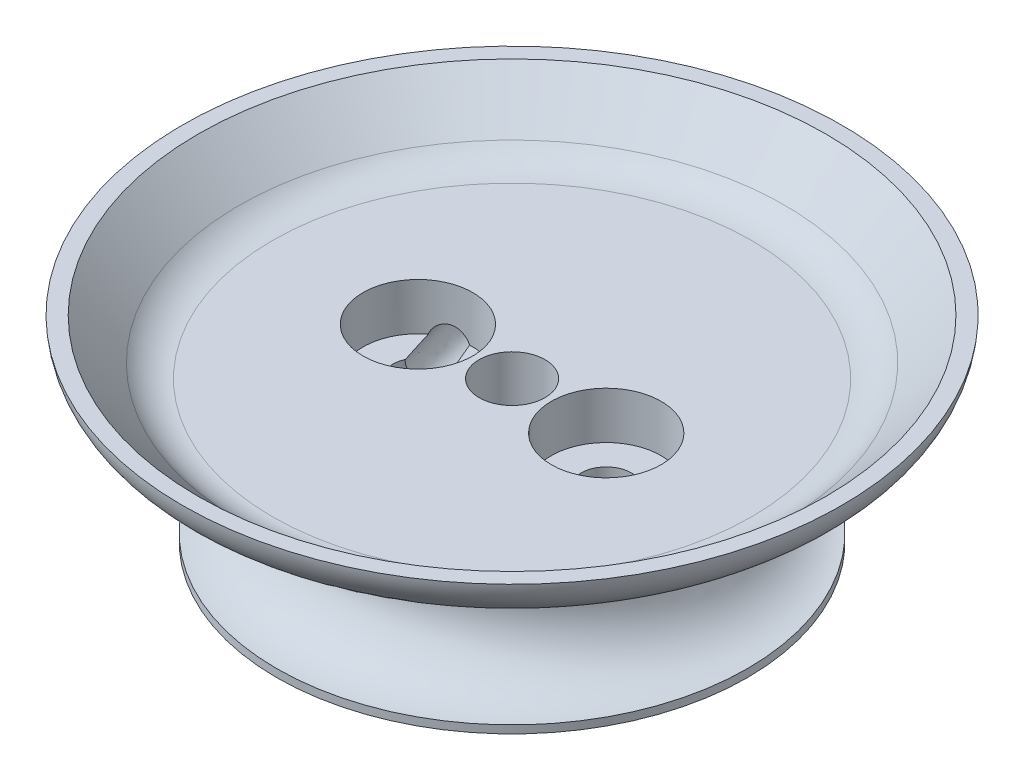
ISO-10303-21;
HEADER;
FILE_DESCRIPTION(('STEP AP214'),'2;1');
FILE_NAME('part.step','',(''),(''),'','','');
FILE_SCHEMA(('AUTOMOTIVE_DESIGN { 1 0 10303 214 1 1 1 1 }'));
ENDSEC;
DATA;
#1=APPLICATION_CONTEXT('core data for automotive mechanical design processes');
#2=APPLICATION_PROTOCOL_DEFINITION('international standard','automotive_design',2000,#1);
#3=PRODUCT_CONTEXT('',#1,'mechanical');
#4=PRODUCT('Part','Part','',(#3));
#5=PRODUCT_RELATED_PRODUCT_CATEGORY('part','',(#4));
#6=PRODUCT_DEFINITION_FORMATION('','',#4);
#7=PRODUCT_DEFINITION_CONTEXT('part definition',#1,'design');
#8=PRODUCT_DEFINITION('design','',#6,#7);
#9=PRODUCT_DEFINITION_SHAPE('','',#8);
#10=(LENGTH_UNIT() NAMED_UNIT(*) SI_UNIT(.MILLI.,.METRE.));
#11=(NAMED_UNIT(*) PLANE_ANGLE_UNIT() SI_UNIT($,.RADIAN.));
#12=(NAMED_UNIT(*) SI_UNIT($,.STERADIAN.) SOLID_ANGLE_UNIT());
#13=UNCERTAINTY_MEASURE_WITH_UNIT(LENGTH_MEASURE(1.E-05),#10,'distance_accuracy_value','');
#14=(GEOMETRIC_REPRESENTATION_CONTEXT(3) GLOBAL_UNCERTAINTY_ASSIGNED_CONTEXT((#13)) GLOBAL_UNIT_ASSIGNED_CONTEXT((#10,
#11,#12)) REPRESENTATION_CONTEXT('',''));
#15=CARTESIAN_POINT('',(0.,0.,0.));
#16=DIRECTION('',(0.,0.,1.));
#17=DIRECTION('',(1.,0.,0.));
#18=AXIS2_PLACEMENT_3D('',#15,#16,#17);
#19=CARTESIAN_POINT('',(0.,4.5,0.));
#20=DIRECTION('',(0.,1.,0.));
#21=DIRECTION('',(0.,0.,1.));
#22=AXIS2_PLACEMENT_3D('',#19,#20,#21);
#23=TOROIDAL_SURFACE('',#22,15.,4.);
#24=CARTESIAN_POINT('',(-7.6107388093674,4.70180364396145,-7.949134860586));
#25=CARTESIAN_POINT('',(-7.61455789786454,4.6686572515954,-7.94315436289037));
#26=CARTESIAN_POINT('',(-7.61958606683922,4.63575123129847,-7.93660843598661));
#27=CARTESIAN_POINT('',(-7.63201156035223,4.5706366477425,-7.92233022037204));
#28=CARTESIAN_POINT('',(-7.6394099111094,4.53842839305623,-7.91459741853621));
#29=CARTESIAN_POINT('',(-7.65656896513071,4.47478605534365,-7.89785053655688));
#30=CARTESIAN_POINT('',(-7.66634204843772,4.44335701310675,-7.88882984746681));
#31=CARTESIAN_POINT('',(-7.6881955341962,4.38176560585421,-7.86941529914597));
#32=CARTESIAN_POINT('',(-7.70027554884008,4.35160302897705,-7.85902167080408));
#33=CARTESIAN_POINT('',(-7.73980693648511,4.26319281944033,-7.82568972230608));
#34=CARTESIAN_POINT('',(-7.77051844963673,4.20713699742779,-7.80062959164697));
#35=CARTESIAN_POINT('',(-7.83922786924663,4.10335920260703,-7.74435467375169));
#36=CARTESIAN_POINT('',(-7.87720306576677,4.05561211841925,-7.71315906075959));
#37=CARTESIAN_POINT('',(-7.93653611921127,3.99373612628725,-7.6628727557003));
#38=CARTESIAN_POINT('',(-7.95577326261854,3.97539155632235,-7.64636019300824));
#39=CARTESIAN_POINT('',(-7.99514440189959,3.94108020268109,-7.61198820152185));
#40=CARTESIAN_POINT('',(-8.0152784580179,3.9251135790423,-7.59412868219808));
#41=CARTESIAN_POINT('',(-8.07662340086016,3.88081674196887,-7.53867873747517));
#42=CARTESIAN_POINT('',(-8.11878929005731,3.8560770914485,-7.49920673870995));
#43=CARTESIAN_POINT('',(-8.2013129719908,3.81757881653221,-7.41850104060084));
#44=CARTESIAN_POINT('',(-8.2416408901938,3.80328596987817,-7.37748743085846));
#45=CARTESIAN_POINT('',(-8.30151525461729,3.78834228058623,-7.31393613310904));
#46=CARTESIAN_POINT('',(-8.32137524098697,3.78444348909593,-7.29240837056939));
#47=CARTESIAN_POINT('',(-8.36077333104861,3.7787786311732,-7.24878414023921));
#48=CARTESIAN_POINT('',(-8.38031138740677,3.77701287565211,-7.22668759002149));
#49=CARTESIAN_POINT('',(-8.4526128554277,3.77417827588447,-7.14318320215401));
#50=CARTESIAN_POINT('',(-8.50402925791464,3.77966918187586,-7.08027941040504));
#51=CARTESIAN_POINT('',(-8.57790969101007,3.79706809778802,-6.98529717121271));
#52=CARTESIAN_POINT('',(-8.60202683081585,3.80441131654224,-6.95348767752394));
#53=CARTESIAN_POINT('',(-8.64920225952622,3.82193836494181,-6.88981575683615));
#54=CARTESIAN_POINT('',(-8.67225993151241,3.83212382578526,-6.85795330991591));
#55=CARTESIAN_POINT('',(-8.72315042488952,3.85813582616913,-6.7861249967763));
#56=CARTESIAN_POINT('',(-8.75066061742847,3.87474076381045,-6.74621256247205));
#57=CARTESIAN_POINT('',(-8.80393332949222,3.91198944408395,-6.66707963548724));
#58=CARTESIAN_POINT('',(-8.82969479444557,3.93263559513763,-6.62785957070492));
#59=CARTESIAN_POINT('',(-8.87955776678746,3.97767647531636,-6.55047969391554));
#60=CARTESIAN_POINT('',(-8.90365779861299,4.00207447599153,-6.51232084189316));
#61=CARTESIAN_POINT('',(-8.95026440716493,4.05436925622113,-6.43748513420039));
#62=CARTESIAN_POINT('',(-8.97277161976179,4.08226462712035,-6.40080768967523));
#63=CARTESIAN_POINT('',(-9.01662807472532,4.14194457311133,-6.32876106876815));
#64=CARTESIAN_POINT('',(-9.03795235129531,4.17378530524648,-6.29342310885723));
#65=CARTESIAN_POINT('',(-9.07903963742292,4.24095283652872,-6.22529431902566));
#66=CARTESIAN_POINT('',(-9.09880406882036,4.27627639333892,-6.19250116991014));
#67=CARTESIAN_POINT('',(-9.13660285097579,4.35029153349616,-6.13039261140444));
#68=CARTESIAN_POINT('',(-9.1546471639613,4.38896088884478,-6.10105690996019));
#69=CARTESIAN_POINT('',(-9.18907308858757,4.46976744562325,-6.0464867412353));
#70=CARTESIAN_POINT('',(-9.20545625519127,4.5119013357881,-6.02124842492263));
#71=CARTESIAN_POINT('',(-9.22916068316583,4.5791101905544,-5.98652786070363));
#72=CARTESIAN_POINT('',(-9.23714978571498,4.60299463798329,-5.97518056424446));
#73=CARTESIAN_POINT('',(-9.25257066391501,4.6517103231883,-5.95414064698203));
#74=CARTESIAN_POINT('',(-9.26000138636458,4.67654322317901,-5.94445111114208));
#75=CARTESIAN_POINT('',(-9.26712645593163,4.70180364396145,-5.93569351516457));
#76=B_SPLINE_CURVE_WITH_KNOTS('',3,(#24,#25,#26,#27,#28,#29,#30,#31,#32,#33,#34,#35,#36,#37,#38,
#39,#40,#41,#42,#43,#44,#45,#46,#47,#48,#49,#50,#51,#52,#53,#54,#55,#56,#57,#58,#59,#60,#61,#62,
#63,#64,#65,#66,#67,#68,#69,#70,#71,#72,#73,#74,#75),.UNSPECIFIED.,.F.,.F.,(4,2,2,2,2,2,2,2,2,2,
2,2,2,2,2,2,2,2,2,2,2,2,2,2,2,4),(0.,0.10166571558766,0.2033755090584,0.305627365976308,
0.407862048913067,0.612692637624994,0.816892991893086,0.910653707829283,1.00442073108311,
1.19189499266689,1.36894212304485,1.45750903984707,1.54608886460597,1.78881212592681,
1.91051003514753,2.03227793246941,2.18579756437597,2.3394089687103,2.49315508721402,
2.64683947829098,2.80303793160987,2.95909232078733,3.11417964853485,3.26912043549941,
3.35192619577278,3.43488441347043),.UNSPECIFIED.);
#77=CARTESIAN_POINT('',(-7.61073880936739,4.70180364396146,-7.94913486058595));
#78=VERTEX_POINT('',#77);
#79=CARTESIAN_POINT('',(-9.26712645593164,4.70180364396146,-5.93569351516459));
#80=VERTEX_POINT('',#79);
#81=EDGE_CURVE('E92',#78,#80,#76,.T.);
#82=ORIENTED_EDGE('',*,*,#81,.F.);
#83=CARTESIAN_POINT('',(0.,4.70180364396145,0.));
#84=DIRECTION('',(0.,-1.,0.));
#85=DIRECTION('',(0.,0.,-1.));
#86=AXIS2_PLACEMENT_3D('',#83,#84,#85);
#87=CIRCLE('',#86,11.0050938322304);
#88=EDGE_CURVE('E97',#78,#80,#87,.T.);
#89=ORIENTED_EDGE('',*,*,#88,.T.);
#90=EDGE_LOOP('',(#82,#89));
#91=FACE_BOUND('',#90,.T.);
#92=CARTESIAN_POINT('',(0.,0.5,0.));
#93=DIRECTION('',(0.,1.,0.));
#94=DIRECTION('',(0.,0.,1.));
#95=AXIS2_PLACEMENT_3D('',#92,#93,#94);
#96=CIRCLE('',#95,15.);
#97=CARTESIAN_POINT('',(0.,0.5,15.));
#98=VERTEX_POINT('',#97);
#99=EDGE_CURVE('E345',#98,#98,#96,.T.);
#100=ORIENTED_EDGE('',*,*,#99,.T.);
#101=EDGE_LOOP('',(#100));
#102=FACE_BOUND('',#101,.T.);
#103=ADVANCED_FACE('F46',(#91,#102),#23,.F.);
#104=CARTESIAN_POINT('',(0.,9.,0.));
#105=DIRECTION('',(0.,-1.,0.));
#106=DIRECTION('',(0.,0.,-1.));
#107=AXIS2_PLACEMENT_3D('',#104,#105,#106);
#108=CYLINDRICAL_SURFACE('',#107,15.);
#109=CARTESIAN_POINT('',(0.,0.,0.));
#110=DIRECTION('',(0.,1.,0.));
#111=DIRECTION('',(0.,0.,1.));
#112=AXIS2_PLACEMENT_3D('',#109,#110,#111);
#113=CIRCLE('',#112,15.);
#114=CARTESIAN_POINT('',(0.,0.,15.));
#115=VERTEX_POINT('',#114);
#116=EDGE_CURVE('E376',#115,#115,#113,.T.);
#117=ORIENTED_EDGE('',*,*,#116,.T.);
#118=EDGE_LOOP('',(#117));
#119=FACE_BOUND('',#118,.T.);
#120=ORIENTED_EDGE('',*,*,#99,.F.);
#121=EDGE_LOOP('',(#120));
#122=FACE_BOUND('',#121,.T.);
#123=ADVANCED_FACE('F196',(#119,#122),#108,.T.);
#124=CARTESIAN_POINT('',(6.,-0.000999999999999265,0.));
#125=DIRECTION('',(0.,1.,0.));
#126=DIRECTION('',(0.,0.,1.));
#127=AXIS2_PLACEMENT_3D('',#124,#125,#126);
#128=CYLINDRICAL_SURFACE('',#127,1.6);
#129=CARTESIAN_POINT('',(6.,0.,0.));
#130=DIRECTION('',(0.,1.,0.));
#131=DIRECTION('',(0.,0.,1.));
#132=AXIS2_PLACEMENT_3D('',#129,#130,#131);
#133=CIRCLE('',#132,1.6);
#134=CARTESIAN_POINT('',(6.,0.,1.6));
#135=VERTEX_POINT('',#134);
#136=EDGE_CURVE('E367',#135,#135,#133,.F.);
#137=ORIENTED_EDGE('',*,*,#136,.T.);
#138=EDGE_LOOP('',(#137));
#139=FACE_BOUND('',#138,.T.);
#140=CARTESIAN_POINT('',(6.,6.,0.));
#141=DIRECTION('',(0.,1.,0.));
#142=DIRECTION('',(0.,0.,1.));
#143=AXIS2_PLACEMENT_3D('',#140,#141,#142);
#144=CIRCLE('',#143,1.6);
#145=CARTESIAN_POINT('',(6.,6.,1.6));
#146=VERTEX_POINT('',#145);
#147=EDGE_CURVE('E370',#146,#146,#144,.F.);
#148=ORIENTED_EDGE('',*,*,#147,.F.);
#149=EDGE_LOOP('',(#148));
#150=FACE_BOUND('',#149,.T.);
#151=ADVANCED_FACE('F192',(#139,#150),#128,.F.);
#152=CARTESIAN_POINT('',(-6.,-0.000999999999999265,0.));
#153=DIRECTION('',(0.,1.,0.));
#154=DIRECTION('',(0.,0.,1.));
#155=AXIS2_PLACEMENT_3D('',#152,#153,#154);
#156=CYLINDRICAL_SURFACE('',#155,1.6);
#157=CARTESIAN_POINT('',(-6.,0.,0.));
#158=DIRECTION('',(0.,1.,0.));
#159=DIRECTION('',(0.,0.,1.));
#160=AXIS2_PLACEMENT_3D('',#157,#158,#159);
#161=CIRCLE('',#160,1.6);
#162=CARTESIAN_POINT('',(-6.,0.,1.6));
#163=VERTEX_POINT('',#162);
#164=EDGE_CURVE('E363',#163,#163,#161,.F.);
#165=ORIENTED_EDGE('',*,*,#164,.T.);
#166=EDGE_LOOP('',(#165));
#167=FACE_BOUND('',#166,.T.);
#168=CARTESIAN_POINT('',(-6.,6.,0.));
#169=DIRECTION('',(0.,1.,0.));
#170=DIRECTION('',(0.,0.,1.));
#171=AXIS2_PLACEMENT_3D('',#168,#169,#170);
#172=CIRCLE('',#171,1.6);
#173=CARTESIAN_POINT('',(-5.34895896784697,6.,-1.46155587455735));
#174=VERTEX_POINT('',#173);
#175=CARTESIAN_POINT('',(-7.45937001936482,6.,-0.655926174640964));
#176=VERTEX_POINT('',#175);
#177=EDGE_CURVE('E354',#174,#176,#172,.F.);
#178=ORIENTED_EDGE('',*,*,#177,.F.);
#179=CARTESIAN_POINT('',(-5.34895896784697,6.,-1.46155587455735));
#180=CARTESIAN_POINT('',(-5.34354743783377,5.97388547998231,-1.45913946316189));
#181=CARTESIAN_POINT('',(-5.33920814498966,5.94750510563134,-1.45717613996484));
#182=CARTESIAN_POINT('',(-5.33270620521504,5.89443880669064,-1.45421330527356));
#183=CARTESIAN_POINT('',(-5.33054238254293,5.86775305503943,-1.45321327317704));
#184=CARTESIAN_POINT('',(-5.32842794779344,5.81453297946142,-1.45223668227594));
#185=CARTESIAN_POINT('',(-5.3284560594642,5.78799969952312,-1.45225028446139));
#186=CARTESIAN_POINT('',(-5.33063461449203,5.73504594971222,-1.45325521014921));
#187=CARTESIAN_POINT('',(-5.33278523097452,5.70862548921848,-1.45424661340746));
#188=CARTESIAN_POINT('',(-5.34225970708156,5.62988052923174,-1.45857207190879));
#189=CARTESIAN_POINT('',(-5.35260253187795,5.57796094987053,-1.46325586312633));
#190=CARTESIAN_POINT('',(-5.38060283869132,5.47641287868827,-1.47532054640152));
#191=CARTESIAN_POINT('',(-5.39828112719855,5.42679135377635,-1.48270910324571));
#192=CARTESIAN_POINT('',(-5.44841079408508,5.310067410268,-1.50224813083063));
#193=CARTESIAN_POINT('',(-5.48394836874233,5.24439054558051,-1.51509440939141));
#194=CARTESIAN_POINT('',(-5.54510689948069,5.15104246461297,-1.53412175515823));
#195=CARTESIAN_POINT('',(-5.56683873080809,5.12074778009602,-1.5404327659997));
#196=CARTESIAN_POINT('',(-5.6126908309768,5.06192445402605,-1.55259621219412));
#197=CARTESIAN_POINT('',(-5.63681099914086,5.03339573811323,-1.5584486668583));
#198=CARTESIAN_POINT('',(-5.71336040051668,4.94985448767858,-1.57498884373283));
#199=CARTESIAN_POINT('',(-5.76937892723524,4.8977994593568,-1.58445479407132));
#200=CARTESIAN_POINT('',(-5.8897152894564,4.80359209425611,-1.59733453630503));
#201=CARTESIAN_POINT('',(-5.95400745334089,4.76141021867889,-1.60076658655961));
#202=CARTESIAN_POINT('',(-6.06777615882716,4.70108533968558,-1.59923088774722));
#203=CARTESIAN_POINT('',(-6.1154925955535,4.67956041238923,-1.59658003224347));
#204=CARTESIAN_POINT('',(-6.21295921122062,4.64330950431066,-1.58651899562207));
#205=CARTESIAN_POINT('',(-6.26270707575785,4.6285760090299,-1.57911409652021));
#206=CARTESIAN_POINT('',(-6.36325283480994,4.60688995988733,-1.55906598560806));
#207=CARTESIAN_POINT('',(-6.41405550234699,4.59998960220922,-1.54638839447616));
#208=CARTESIAN_POINT('',(-6.51455898662215,4.5948892250152,-1.51591059981735));
#209=CARTESIAN_POINT('',(-6.56425966734489,4.59669027355202,-1.49810976769123));
#210=CARTESIAN_POINT('',(-6.65600493741798,4.6077016353767,-1.46009570316903));
#211=CARTESIAN_POINT('',(-6.69831938406,4.61615733235881,-1.44029840281659));
#212=CARTESIAN_POINT('',(-6.77978631475333,4.63898566649539,-1.39787064485384));
#213=CARTESIAN_POINT('',(-6.81893919319233,4.65335756426926,-1.37524054152058));
#214=CARTESIAN_POINT('',(-6.89698004884233,4.68903042922083,-1.32580334048839));
#215=CARTESIAN_POINT('',(-6.93550698175521,4.71085023960296,-1.29880350254185));
#216=CARTESIAN_POINT('',(-7.00785924848329,4.7599322941682,-1.24350405389966));
#217=CARTESIAN_POINT('',(-7.04167993824347,4.78719985040042,-1.21520319549135));
#218=CARTESIAN_POINT('',(-7.12312786790557,4.86299907029928,-1.14153439768283));
#219=CARTESIAN_POINT('',(-7.16742719990196,4.91470802399358,-1.09576220752942));
#220=CARTESIAN_POINT('',(-7.24599690117387,5.0264628006792,-1.00551932213198));
#221=CARTESIAN_POINT('',(-7.28023750763752,5.08653260494304,-0.961052832858524));
#222=CARTESIAN_POINT('',(-7.32476726839249,5.18270183933272,-0.897596669083694));
#223=CARTESIAN_POINT('',(-7.33855522879746,5.21606518044797,-0.876830300829076));
#224=CARTESIAN_POINT('',(-7.36388376067582,5.28457969857245,-0.836885984439337));
#225=CARTESIAN_POINT('',(-7.37542346541774,5.31973155851852,-0.817708650528291));
#226=CARTESIAN_POINT('',(-7.39631411551475,5.39165443481449,-0.781500773448133));
#227=CARTESIAN_POINT('',(-7.40566960054749,5.428421900726,-0.764465812215923));
#228=CARTESIAN_POINT('',(-7.42226984426036,5.50354893295271,-0.733118408118711));
#229=CARTESIAN_POINT('',(-7.42951619044762,5.5419072768697,-0.718803920438187));
#230=CARTESIAN_POINT('',(-7.43967508960075,5.60621701858137,-0.698152669490929));
#231=CARTESIAN_POINT('',(-7.44321302714255,5.63174076184247,-0.690787504215386));
#232=CARTESIAN_POINT('',(-7.44935870179006,5.6833443084123,-0.677798917239184));
#233=CARTESIAN_POINT('',(-7.45196642725569,5.70942411867497,-0.672175517333992));
#234=CARTESIAN_POINT('',(-7.4562437161758,5.76191093698792,-0.662857726590875));
#235=CARTESIAN_POINT('',(-7.45791649148475,5.78831650235379,-0.659156734798353));
#236=CARTESIAN_POINT('',(-7.46029412883945,5.84138048288216,-0.653872882923651));
#237=CARTESIAN_POINT('',(-7.46099933798618,5.86803880391461,-0.652289263268678));
#238=CARTESIAN_POINT('',(-7.46133861238145,5.91228121009195,-0.651528591757561));
#239=CARTESIAN_POINT('',(-7.46125627471148,5.92985450344877,-0.651714282225484));
#240=CARTESIAN_POINT('',(-7.46064833765346,5.96497005838659,-0.653074372988947));
#241=CARTESIAN_POINT('',(-7.46012235717764,5.98251228029085,-0.654249623311795));
#242=CARTESIAN_POINT('',(-7.45937001936482,6.,-0.655926174640966));
#243=B_SPLINE_CURVE_WITH_KNOTS('',3,(#179,#180,#181,#182,#183,#184,#185,#186,#187,#188,#189,
#190,#191,#192,#193,#194,#195,#196,#197,#198,#199,#200,#201,#202,#203,#204,#205,#206,#207,#208,
#209,#210,#211,#212,#213,#214,#215,#216,#217,#218,#219,#220,#221,#222,#223,#224,#225,#226,#227,
#228,#229,#230,#231,#232,#233,#234,#235,#236,#237,#238,#239,#240,#241,#242),.UNSPECIFIED.,.F.,
.F.,(4,2,2,2,2,2,2,2,2,2,2,2,2,2,2,2,2,2,2,2,2,2,2,2,2,2,2,2,2,2,2,4),(0.,0.0803118497854571,
0.160580271338293,0.240069656544772,0.319565525963129,0.4782268560908,0.637341327195638,
0.863377729357667,0.976722655297722,1.09006280536199,1.32003693785584,1.54931397155168,
1.70594552976636,1.86240336177528,2.01989774230956,2.17741145495793,2.31926140202512,
2.46109362669281,2.61607437561524,2.77120698901708,3.01606230738722,3.26163499581189,
3.38646440616901,3.51134184505678,3.6359573812969,3.76047887788334,3.84081196008785,
3.92114604749452,4.00120243803904,4.08123010194418,4.13392227443352,4.1866597554843),.UNSPECIFIED.);
#244=EDGE_CURVE('E127',#174,#176,#243,.T.);
#245=ORIENTED_EDGE('',*,*,#244,.T.);
#246=EDGE_LOOP('',(#178,#245));
#247=FACE_BOUND('',#246,.T.);
#248=ADVANCED_FACE('F187',(#167,#247),#156,.F.);
#249=CARTESIAN_POINT('',(0.,9.,0.));
#250=DIRECTION('',(0.,1.,0.));
#251=DIRECTION('',(0.,0.,1.));
#252=AXIS2_PLACEMENT_3D('',#249,#250,#251);
#253=PLANE('',#252);
#254=CARTESIAN_POINT('',(0.,9.,0.));
#255=DIRECTION('',(0.,1.,0.));
#256=DIRECTION('',(0.,0.,1.));
#257=AXIS2_PLACEMENT_3D('',#254,#255,#256);
#258=CIRCLE('',#257,15.2573593128808);
#259=CARTESIAN_POINT('',(0.,9.,15.2573593128808));
#260=VERTEX_POINT('',#259);
#261=EDGE_CURVE('E387',#260,#260,#258,.T.);
#262=ORIENTED_EDGE('',*,*,#261,.T.);
#263=EDGE_LOOP('',(#262));
#264=FACE_BOUND('',#263,.T.);
#265=CARTESIAN_POINT('',(-6.,9.,0.));
#266=DIRECTION('',(0.,1.,0.));
#267=DIRECTION('',(0.,0.,1.));
#268=AXIS2_PLACEMENT_3D('',#265,#266,#267);
#269=CIRCLE('',#268,3.5);
#270=CARTESIAN_POINT('',(-6.,9.,3.5));
#271=VERTEX_POINT('',#270);
#272=EDGE_CURVE('E355',#271,#271,#269,.T.);
#273=ORIENTED_EDGE('',*,*,#272,.F.);
#274=EDGE_LOOP('',(#273));
#275=FACE_BOUND('',#274,.T.);
#276=CARTESIAN_POINT('',(6.,9.,0.));
#277=DIRECTION('',(0.,1.,0.));
#278=DIRECTION('',(0.,0.,1.));
#279=AXIS2_PLACEMENT_3D('',#276,#277,#278);
#280=CIRCLE('',#279,3.5);
#281=CARTESIAN_POINT('',(6.,9.,3.5));
#282=VERTEX_POINT('',#281);
#283=EDGE_CURVE('E347',#282,#282,#280,.T.);
#284=ORIENTED_EDGE('',*,*,#283,.F.);
#285=EDGE_LOOP('',(#284));
#286=FACE_BOUND('',#285,.T.);
#287=CARTESIAN_POINT('',(0.,9.,0.));
#288=DIRECTION('',(0.,1.,0.));
#289=DIRECTION('',(0.,0.,1.));
#290=AXIS2_PLACEMENT_3D('',#287,#288,#289);
#291=CIRCLE('',#290,2.1);
#292=CARTESIAN_POINT('',(0.,9.,2.1));
#293=VERTEX_POINT('',#292);
#294=EDGE_CURVE('E366',#293,#293,#291,.T.);
#295=ORIENTED_EDGE('',*,*,#294,.F.);
#296=EDGE_LOOP('',(#295));
#297=FACE_BOUND('',#296,.T.);
#298=ADVANCED_FACE('F191',(#264,#275,#286,#297),#253,.T.);
#299=CARTESIAN_POINT('',(0.,0.,0.));
#300=DIRECTION('',(0.,1.,0.));
#301=DIRECTION('',(0.,0.,1.));
#302=AXIS2_PLACEMENT_3D('',#299,#300,#301);
#303=PLANE('',#302);
#304=ORIENTED_EDGE('',*,*,#164,.F.);
#305=EDGE_LOOP('',(#304));
#306=FACE_BOUND('',#305,.T.);
#307=ORIENTED_EDGE('',*,*,#136,.F.);
#308=EDGE_LOOP('',(#307));
#309=FACE_BOUND('',#308,.T.);
#310=CARTESIAN_POINT('',(0.,0.,0.));
#311=DIRECTION('',(0.,1.,0.));
#312=DIRECTION('',(0.,0.,1.));
#313=AXIS2_PLACEMENT_3D('',#310,#311,#312);
#314=CIRCLE('',#313,2.1);
#315=CARTESIAN_POINT('',(0.,0.,2.1));
#316=VERTEX_POINT('',#315);
#317=EDGE_CURVE('E373',#316,#316,#314,.F.);
#318=ORIENTED_EDGE('',*,*,#317,.F.);
#319=EDGE_LOOP('',(#318));
#320=FACE_BOUND('',#319,.T.);
#321=ORIENTED_EDGE('',*,*,#116,.F.);
#322=EDGE_LOOP('',(#321));
#323=FACE_BOUND('',#322,.T.);
#324=ADVANCED_FACE('F200',(#306,#309,#320,#323),#303,.F.);
#325=CARTESIAN_POINT('',(0.,-0.000999999999999265,0.));
#326=DIRECTION('',(0.,1.,0.));
#327=DIRECTION('',(0.,0.,1.));
#328=AXIS2_PLACEMENT_3D('',#325,#326,#327);
#329=CYLINDRICAL_SURFACE('',#328,2.1);
#330=ORIENTED_EDGE('',*,*,#294,.T.);
#331=EDGE_LOOP('',(#330));
#332=FACE_BOUND('',#331,.T.);
#333=ORIENTED_EDGE('',*,*,#317,.T.);
#334=EDGE_LOOP('',(#333));
#335=FACE_BOUND('',#334,.T.);
#336=ADVANCED_FACE('F171',(#332,#335),#329,.F.);
#337=CARTESIAN_POINT('',(-6.,6.,0.));
#338=DIRECTION('',(0.,1.,0.));
#339=DIRECTION('',(0.,0.,1.));
#340=AXIS2_PLACEMENT_3D('',#337,#338,#339);
#341=PLANE('',#340);
#342=CARTESIAN_POINT('',(-8.35647468352968,6.,-3.542));
#343=CARTESIAN_POINT('',(-8.33126931915313,6.,-3.45874192629009));
#344=CARTESIAN_POINT('',(-8.30601027071329,6.,-3.37550006949083));
#345=CARTESIAN_POINT('',(-8.25537049367135,6.,-3.20905347977165));
#346=CARTESIAN_POINT('',(-8.22998976520314,6.,-3.12584874681099));
#347=CARTESIAN_POINT('',(-8.15364358360475,6.,-2.87629723981282));
#348=CARTESIAN_POINT('',(-8.10247405989645,6.,-2.71001291164647));
#349=CARTESIAN_POINT('',(-7.99980727414744,6.,-2.3775457814614));
#350=CARTESIAN_POINT('',(-7.94831001247933,6.,-2.21136297932747));
#351=CARTESIAN_POINT('',(-7.84490202990216,6.,-1.87912599842375));
#352=CARTESIAN_POINT('',(-7.79299130907052,6.,-1.71307181962987));
#353=CARTESIAN_POINT('',(-7.70037054390102,6.,-1.4180322218888));
#354=CARTESIAN_POINT('',(-7.65973903099436,6.,-1.28902212761576));
#355=CARTESIAN_POINT('',(-7.57830470179725,6.,-1.03105599650208));
#356=CARTESIAN_POINT('',(-7.53750188547916,6.00000000000001,-0.902099959670178));
#357=CARTESIAN_POINT('',(-7.45569746773269,5.99999999999999,-0.644251139095274));
#358=CARTESIAN_POINT('',(-7.4146958665781,5.99999999999997,-0.515358355265425));
#359=CARTESIAN_POINT('',(-7.33250135783483,6.00000000000003,-0.257633887407563));
#360=CARTESIAN_POINT('',(-7.29130845036692,6.0000000000001,-0.128802203341033));
#361=CARTESIAN_POINT('',(-7.25002363107773,6.00000000000027,0.));
#362=B_SPLINE_CURVE_WITH_KNOTS('',3,(#342,#343,#344,#345,#346,#347,#348,#349,#350,#351,#352,
#353,#354,#355,#356,#357,#358,#359,#360,#361),.UNSPECIFIED.,.F.,.F.,(4,2,2,2,2,2,2,2,2,4),(0.,
0.260969298175503,0.521938309277581,1.04387556044948,1.56581221835927,2.08774877854107,
2.49352039078019,2.89929206847244,3.30506318744342,3.71083405027708),.UNSPECIFIED.);
#363=CARTESIAN_POINT('',(-8.1244278768601,6.00000000000009,-2.78151149485663));
#364=VERTEX_POINT('',#363);
#365=EDGE_CURVE('E162',#364,#176,#362,.T.);
#366=ORIENTED_EDGE('',*,*,#365,.F.);
#367=CARTESIAN_POINT('',(-6.,6.,0.));
#368=DIRECTION('',(0.,1.,0.));
#369=DIRECTION('',(0.,0.,1.));
#370=AXIS2_PLACEMENT_3D('',#367,#368,#369);
#371=CIRCLE('',#370,3.5);
#372=CARTESIAN_POINT('',(-6.19929416576677,6.,-3.49432136980721));
#373=VERTEX_POINT('',#372);
#374=EDGE_CURVE('E351',#364,#373,#371,.T.);
#375=ORIENTED_EDGE('',*,*,#374,.T.);
#376=CARTESIAN_POINT('',(-4.7499763689214,5.99999999550742,0.));
#377=CARTESIAN_POINT('',(-4.88108672960505,5.9999999983886,-0.322315978388525));
#378=CARTESIAN_POINT('',(-5.01271949210917,5.99999999956866,-0.644420109012574));
#379=CARTESIAN_POINT('',(-5.27716233189795,6.00000000043133,-1.28813885260762));
#380=CARTESIAN_POINT('',(-5.40997239108258,6.00000000011396,-1.60975347301571));
#381=CARTESIAN_POINT('',(-5.65512436235315,5.99999999990508,-2.19999384473839));
#382=CARTESIAN_POINT('',(-5.76726935052881,5.99999999995252,-2.46870134914585));
#383=CARTESIAN_POINT('',(-5.99259287875699,6.00000000004748,-3.00568664071589));
#384=CARTESIAN_POINT('',(-6.10577143206499,6.000000000095,-3.27396442231526));
#385=CARTESIAN_POINT('',(-6.21952210859289,5.99999999999999,-3.54200000000006));
#386=B_SPLINE_CURVE_WITH_KNOTS('',3,(#376,#377,#378,#379,#380,#381,#382,#383,#384,#385),
.UNSPECIFIED.,.F.,.F.,(4,2,2,2,4),(0.,1.04388629653505,2.08775657184761,2.96126582559288,
3.83478629787715),.UNSPECIFIED.);
#387=EDGE_CURVE('E67',#174,#373,#386,.T.);
#388=ORIENTED_EDGE('',*,*,#387,.F.);
#389=ORIENTED_EDGE('',*,*,#177,.T.);
#390=EDGE_LOOP('',(#366,#375,#388,#389));
#391=FACE_BOUND('',#390,.T.);
#392=ADVANCED_FACE('F167',(#391),#341,.T.);
#393=CARTESIAN_POINT('',(-6.,6.,0.));
#394=DIRECTION('',(0.,1.,0.));
#395=DIRECTION('',(0.,0.,1.));
#396=AXIS2_PLACEMENT_3D('',#393,#394,#395);
#397=CYLINDRICAL_SURFACE('',#396,3.5);
#398=ORIENTED_EDGE('',*,*,#374,.F.);
#399=CARTESIAN_POINT('',(-8.1244278768601,6.00000000000009,-2.78151149485663));
#400=CARTESIAN_POINT('',(-8.11651944405576,6.02876046472808,-2.78755006338255));
#401=CARTESIAN_POINT('',(-8.10762051000732,6.05708159303239,-2.79429529417439));
#402=CARTESIAN_POINT('',(-8.08788014312225,6.11269172861009,-2.80907639357384));
#403=CARTESIAN_POINT('',(-8.07703870884212,6.13998073511647,-2.81711226314055));
#404=CARTESIAN_POINT('',(-8.04167774775737,6.22002561000408,-2.84295766594701));
#405=CARTESIAN_POINT('',(-8.01430848068018,6.27100694202752,-2.86251528742381));
#406=CARTESIAN_POINT('',(-7.95214152160995,6.36663868959375,-2.90526369168859));
#407=CARTESIAN_POINT('',(-7.91733401218038,6.41128060710479,-2.92845926519147));
#408=CARTESIAN_POINT('',(-7.86006472353439,6.47242237937166,-2.96490701443996));
#409=CARTESIAN_POINT('',(-7.84012608879749,6.49183709514101,-2.97733545742032));
#410=CARTESIAN_POINT('',(-7.798617153619,6.52854417511778,-3.00259327283212));
#411=CARTESIAN_POINT('',(-7.77704689958762,6.54583659965554,-3.01542263385364));
#412=CARTESIAN_POINT('',(-7.71127417770486,6.59360190916129,-3.05353157239175));
#413=CARTESIAN_POINT('',(-7.6649847073752,6.62104728543857,-3.07909516925206));
#414=CARTESIAN_POINT('',(-7.56782452030125,6.66680896417044,-3.12968446106431));
#415=CARTESIAN_POINT('',(-7.51695467117479,6.68512699125526,-3.15471025677906));
#416=CARTESIAN_POINT('',(-7.41331905708962,6.71124406971469,-3.2024509426107));
#417=CARTESIAN_POINT('',(-7.36064111578575,6.71931285438829,-3.2252098900007));
#418=CARTESIAN_POINT('',(-7.25369990634352,6.72642060085331,-3.26826537521821));
#419=CARTESIAN_POINT('',(-7.19943663472858,6.72545954284115,-3.28856190764524));
#420=CARTESIAN_POINT('',(-7.11775379248441,6.717256714012,-3.31684691340708));
#421=CARTESIAN_POINT('',(-7.09034827941313,6.71336094777403,-3.32595302871812));
#422=CARTESIAN_POINT('',(-7.03571566454379,6.70323698360544,-3.34336868390563));
#423=CARTESIAN_POINT('',(-7.0084885423436,6.69700905730911,-3.35167831640954));
#424=CARTESIAN_POINT('',(-6.92739599056379,6.67488889660071,-3.37536685807988));
#425=CARTESIAN_POINT('',(-6.87408533991115,6.65555686985006,-3.38951709843634));
#426=CARTESIAN_POINT('',(-6.76908425791259,6.60859084678455,-3.41489288167472));
#427=CARTESIAN_POINT('',(-6.71745498058654,6.58078411530159,-3.42604749489769));
#428=CARTESIAN_POINT('',(-6.64309585595728,6.5335752502232,-3.44050416925807));
#429=CARTESIAN_POINT('',(-6.61881069395804,6.5169114676514,-3.44494572874914));
#430=CARTESIAN_POINT('',(-6.57146283547718,6.48176391880923,-3.45311551528899));
#431=CARTESIAN_POINT('',(-6.54840007237061,6.46328025188605,-3.4568437812437));
#432=CARTESIAN_POINT('',(-6.50141227811694,6.42266604424717,-3.46398704179358));
#433=CARTESIAN_POINT('',(-6.47763204829483,6.40035565835303,-3.46733331354099));
#434=CARTESIAN_POINT('',(-6.43185036734704,6.35389894975064,-3.4733324857037));
#435=CARTESIAN_POINT('',(-6.40984945997009,6.32975207016407,-3.47598517471375));
#436=CARTESIAN_POINT('',(-6.34673948437037,6.25484802745491,-3.48303906400444));
#437=CARTESIAN_POINT('',(-6.3084404841006,6.20155549897072,-3.48654790531168));
#438=CARTESIAN_POINT('',(-6.26041506536084,6.12221310936525,-3.49032758317458));
#439=CARTESIAN_POINT('',(-6.2470203213988,6.09833365253075,-3.49129503664224));
#440=CARTESIAN_POINT('',(-6.2218979190216,6.04976641954756,-3.49298128159706));
#441=CARTESIAN_POINT('',(-6.21016695298712,6.02508037070397,-3.49370057063908));
#442=CARTESIAN_POINT('',(-6.19929416576677,6.,-3.49432136980721));
#443=B_SPLINE_CURVE_WITH_KNOTS('',3,(#399,#400,#401,#402,#403,#404,#405,#406,#407,#408,#409,
#410,#411,#412,#413,#414,#415,#416,#417,#418,#419,#420,#421,#422,#423,#424,#425,#426,#427,#428,
#429,#430,#431,#432,#433,#434,#435,#436,#437,#438,#439,#440,#441,#442),.UNSPECIFIED.,.F.,.F.,(4,
2,2,2,2,2,2,2,2,2,2,2,2,2,2,2,2,2,2,2,2,4),(0.,0.091238364589495,0.182476796979947,
0.364804221301337,0.547373795187147,0.638706294758486,0.730036197420372,0.907862063472263,
1.08565431622995,1.2586634359524,1.43167293510555,1.51900521119134,1.60632731856432,
1.78086455671559,1.95922869940809,2.04851227921543,2.13779098774584,2.23600709507087,
2.33425310403639,2.53041785685191,2.6125604869293,2.69453745561658),.UNSPECIFIED.);
#444=EDGE_CURVE('E101',#364,#373,#443,.T.);
#445=ORIENTED_EDGE('',*,*,#444,.T.);
#446=EDGE_LOOP('',(#398,#445));
#447=FACE_BOUND('',#446,.T.);
#448=ORIENTED_EDGE('',*,*,#272,.T.);
#449=EDGE_LOOP('',(#448));
#450=FACE_BOUND('',#449,.T.);
#451=ADVANCED_FACE('F170',(#447,#450),#397,.F.);
#452=CARTESIAN_POINT('',(6.,6.,0.));
#453=DIRECTION('',(0.,1.,0.));
#454=DIRECTION('',(0.,0.,1.));
#455=AXIS2_PLACEMENT_3D('',#452,#453,#454);
#456=PLANE('',#455);
#457=CARTESIAN_POINT('',(6.,6.,0.));
#458=DIRECTION('',(0.,1.,0.));
#459=DIRECTION('',(0.,0.,1.));
#460=AXIS2_PLACEMENT_3D('',#457,#458,#459);
#461=CIRCLE('',#460,3.5);
#462=CARTESIAN_POINT('',(6.,6.,3.5));
#463=VERTEX_POINT('',#462);
#464=EDGE_CURVE('E358',#463,#463,#461,.T.);
#465=ORIENTED_EDGE('',*,*,#464,.T.);
#466=EDGE_LOOP('',(#465));
#467=FACE_BOUND('',#466,.T.);
#468=ORIENTED_EDGE('',*,*,#147,.T.);
#469=EDGE_LOOP('',(#468));
#470=FACE_BOUND('',#469,.T.);
#471=ADVANCED_FACE('F178',(#467,#470),#456,.T.);
#472=CARTESIAN_POINT('',(6.,6.,0.));
#473=DIRECTION('',(0.,1.,0.));
#474=DIRECTION('',(0.,0.,1.));
#475=AXIS2_PLACEMENT_3D('',#472,#473,#474);
#476=CYLINDRICAL_SURFACE('',#475,3.5);
#477=ORIENTED_EDGE('',*,*,#464,.F.);
#478=EDGE_LOOP('',(#477));
#479=FACE_BOUND('',#478,.T.);
#480=ORIENTED_EDGE('',*,*,#283,.T.);
#481=EDGE_LOOP('',(#480));
#482=FACE_BOUND('',#481,.T.);
#483=ADVANCED_FACE('F182',(#479,#482),#476,.F.);
#484=CARTESIAN_POINT('',(0.,5.26965052646151,0.));
#485=DIRECTION('',(0.,1.,0.));
#486=DIRECTION('',(0.,0.,1.));
#487=AXIS2_PLACEMENT_3D('',#484,#485,#486);
#488=CONICAL_SURFACE('',#487,11.0747435667058,1.0471975511966);
#489=CARTESIAN_POINT('',(0.,5.51737813675556,0.));
#490=DIRECTION('',(0.,-1.,0.));
#491=DIRECTION('',(0.,0.,-1.));
#492=AXIS2_PLACEMENT_3D('',#489,#490,#491);
#493=CIRCLE('',#492,11.5038203741727);
#494=CARTESIAN_POINT('',(-9.51467645596794,5.51737813675557,-6.46597364203405));
#495=VERTEX_POINT('',#494);
#496=CARTESIAN_POINT('',(-7.89685994266537,5.51737813675556,-8.36525470306543));
#497=VERTEX_POINT('',#496);
#498=EDGE_CURVE('E103',#495,#497,#493,.F.);
#499=ORIENTED_EDGE('',*,*,#498,.T.);
#500=CARTESIAN_POINT('',(-7.89685994266538,5.51737813675556,-8.36525470306541));
#501=CARTESIAN_POINT('',(-7.92815806980376,5.5461793788181,-8.40430717736159));
#502=CARTESIAN_POINT('',(-7.96088667108223,5.57507164590215,-8.44222983629755));
#503=CARTESIAN_POINT('',(-8.02973173582263,5.63304496850331,-8.51532824937924));
#504=CARTESIAN_POINT('',(-8.06586921692049,5.66212600601803,-8.55048413035107));
#505=CARTESIAN_POINT('',(-8.14241575320247,5.72068099093767,-8.61769492117997));
#506=CARTESIAN_POINT('',(-8.18289621299481,5.7501510465318,-8.64967306433292));
#507=CARTESIAN_POINT('',(-8.26776976843107,5.80845585955741,-8.70837110435774));
#508=CARTESIAN_POINT('',(-8.31215079742888,5.83729225372424,-8.73510644477353));
#509=CARTESIAN_POINT('',(-8.39413194942155,5.88712385863458,-8.77617577076814));
#510=CARTESIAN_POINT('',(-8.43085506337128,5.90836129282966,-8.79194733684481));
#511=CARTESIAN_POINT('',(-8.50668233402289,5.94963970298376,-8.81821514977181));
#512=CARTESIAN_POINT('',(-8.54577891360064,5.96968411965131,-8.82872728659274));
#513=CARTESIAN_POINT('',(-8.62658728322283,6.00825326025442,-8.84335345732861));
#514=CARTESIAN_POINT('',(-8.66832665845958,6.02675459098593,-8.84738172394634));
#515=CARTESIAN_POINT('',(-8.75294891980334,6.06102131724289,-8.84735631247562));
#516=CARTESIAN_POINT('',(-8.79582977230463,6.07679124588553,-8.84331616738399));
#517=CARTESIAN_POINT('',(-8.87035693529856,6.10108378179834,-8.82827431491956));
#518=CARTESIAN_POINT('',(-8.90213778463984,6.11043296654819,-8.819260253551));
#519=CARTESIAN_POINT('',(-8.96441847306213,6.12664865899378,-8.79609549246852));
#520=CARTESIAN_POINT('',(-8.99491967777978,6.13351787611763,-8.78195043259344));
#521=CARTESIAN_POINT('',(-9.05362949425102,6.14454839556365,-8.7489272745438));
#522=CARTESIAN_POINT('',(-9.08184440282573,6.14871737309762,-8.73006280468186));
#523=CARTESIAN_POINT('',(-9.13571156432035,6.15466350602827,-8.68862875062713));
#524=CARTESIAN_POINT('',(-9.16135869602113,6.15643596642537,-8.66605199043195));
#525=CARTESIAN_POINT('',(-9.22227663811685,6.15825582017047,-8.60590140653611));
#526=CARTESIAN_POINT('',(-9.25581530543727,6.15696896273191,-8.56653646924952));
#527=CARTESIAN_POINT('',(-9.31692723334339,6.15063054069685,-8.48373589742003));
#528=CARTESIAN_POINT('',(-9.34449091989036,6.1455729908353,-8.44029388722353));
#529=CARTESIAN_POINT('',(-9.38892863067149,6.13381665091099,-8.36018976213046));
#530=CARTESIAN_POINT('',(-9.40683310640394,6.12768032955557,-8.3240037916777));
#531=CARTESIAN_POINT('',(-9.43952007878623,6.11383614626726,-8.25052712554409));
#532=CARTESIAN_POINT('',(-9.45430056393761,6.1061272780298,-8.2132357356087));
#533=CARTESIAN_POINT('',(-9.48129297587808,6.08949845421497,-8.13790840546358));
#534=CARTESIAN_POINT('',(-9.49349844988237,6.08057554617009,-8.09987084985192));
#535=CARTESIAN_POINT('',(-9.51565375155207,6.06176840396595,-8.02339019545483));
#536=CARTESIAN_POINT('',(-9.52560379954503,6.05188426384224,-7.98494713666639));
#537=CARTESIAN_POINT('',(-9.54313806381689,6.03175202406538,-7.90944334067679));
#538=CARTESIAN_POINT('',(-9.55080432958521,6.02153683130733,-7.87239264614104));
#539=CARTESIAN_POINT('',(-9.56447255622174,6.00046891851862,-7.79816208044327));
#540=CARTESIAN_POINT('',(-9.5704742699144,5.98961610409479,-7.76098219092569));
#541=CARTESIAN_POINT('',(-9.58092906935144,5.96733573000311,-7.68655307795376));
#542=CARTESIAN_POINT('',(-9.58538123086867,5.95590783196251,-7.64930382639754));
#543=CARTESIAN_POINT('',(-9.59277066034507,5.93251540905725,-7.57482864932919));
#544=CARTESIAN_POINT('',(-9.59570800849413,5.92055091263504,-7.53760272268652));
#545=CARTESIAN_POINT('',(-9.60251188517563,5.88394108453925,-7.42591532860019));
#546=CARTESIAN_POINT('',(-9.60435606258208,5.85861171620103,-7.35155110448085));
#547=CARTESIAN_POINT('',(-9.6035051283576,5.80655516705314,-7.20338232937567));
#548=CARTESIAN_POINT('',(-9.60081107438588,5.7798283133415,-7.12957765201101));
#549=CARTESIAN_POINT('',(-9.59288057894077,5.73385986876394,-7.00596057838115));
#550=CARTESIAN_POINT('',(-9.58872080595193,5.71493122409031,-6.95595923474137));
#551=CARTESIAN_POINT('',(-9.5785576847919,5.67654966891551,-6.85635284298886));
#552=CARTESIAN_POINT('',(-9.57255456020197,5.657096822256,-6.80674774756319));
#553=CARTESIAN_POINT('',(-9.55885079135789,5.6178535922487,-6.70834042586836));
#554=CARTESIAN_POINT('',(-9.55116301704482,5.59806676475769,-6.65953497553507));
#555=CARTESIAN_POINT('',(-9.53413821907849,5.55804798624696,-6.56239232645346));
#556=CARTESIAN_POINT('',(-9.52480108914378,5.53781600661605,-6.51405515809222));
#557=CARTESIAN_POINT('',(-9.51467645596789,5.5173781367555,-6.46597364203408));
#558=B_SPLINE_CURVE_WITH_KNOTS('',3,(#500,#501,#502,#503,#504,#505,#506,#507,#508,#509,#510,
#511,#512,#513,#514,#515,#516,#517,#518,#519,#520,#521,#522,#523,#524,#525,#526,#527,#528,#529,
#530,#531,#532,#533,#534,#535,#536,#537,#538,#539,#540,#541,#542,#543,#544,#545,#546,#547,#548,
#549,#550,#551,#552,#553,#554,#555,#556,#557),.UNSPECIFIED.,.F.,.F.,(4,2,2,2,2,2,2,2,2,2,2,2,2,
2,2,2,2,2,2,2,2,2,2,2,2,2,2,2,4),(0.,0.173283361180032,0.347715283510764,0.525662320173536,
0.703077039694104,0.838553627956907,0.973618399965172,1.11045551900565,1.24706331645574,
1.34959909167874,1.45202250249885,1.55415349040518,1.65648427388953,1.81081385252635,
1.96538892328667,2.08771831656584,2.21012623785916,2.33283735336257,2.45553647631892,
2.57306325576782,2.69060747787397,2.80822168932011,2.92582967396791,3.16138236135762,
3.3968801595218,3.55772466494247,3.7185496691356,3.87818640816343,4.03783343764411),.UNSPECIFIED.);
#559=EDGE_CURVE('E75',#497,#495,#558,.T.);
#560=ORIENTED_EDGE('',*,*,#559,.T.);
#561=EDGE_LOOP('',(#499,#560));
#562=FACE_BOUND('',#561,.T.);
#563=CARTESIAN_POINT('',(0.,10.1394101981179,0.));
#564=DIRECTION('',(0.,-1.,0.));
#565=DIRECTION('',(0.,0.,-1.));
#566=AXIS2_PLACEMENT_3D('',#563,#564,#565);
#567=CIRCLE('',#566,19.5094147386646);
#568=CARTESIAN_POINT('',(0.,10.1394101981179,-19.5094147386646));
#569=VERTEX_POINT('',#568);
#570=EDGE_CURVE('E384',#569,#569,#567,.T.);
#571=ORIENTED_EDGE('',*,*,#570,.T.);
#572=EDGE_LOOP('',(#571));
#573=FACE_BOUND('',#572,.T.);
#574=ADVANCED_FACE('F185',(#562,#573),#488,.T.);
#575=CARTESIAN_POINT('',(0.,12.5,-15.));
#576=DIRECTION('',(0.,-1.,0.));
#577=DIRECTION('',(0.,0.,-1.));
#578=AXIS2_PLACEMENT_3D('',#575,#576,#577);
#579=PLANE('',#578);
#580=CARTESIAN_POINT('',(0.,12.5,0.));
#581=DIRECTION('',(0.,-1.,0.));
#582=DIRECTION('',(0.,0.,-1.));
#583=AXIS2_PLACEMENT_3D('',#580,#581,#582);
#584=CIRCLE('',#583,20.);
#585=CARTESIAN_POINT('',(0.,12.5,-20.));
#586=VERTEX_POINT('',#585);
#587=EDGE_CURVE('E340',#586,#586,#584,.T.);
#588=ORIENTED_EDGE('',*,*,#587,.T.);
#589=EDGE_LOOP('',(#588));
#590=FACE_BOUND('',#589,.T.);
#591=CARTESIAN_POINT('',(0.,12.5,0.));
#592=DIRECTION('',(0.,1.,0.));
#593=DIRECTION('',(0.,0.,1.));
#594=AXIS2_PLACEMENT_3D('',#591,#592,#593);
#595=CIRCLE('',#594,21.);
#596=CARTESIAN_POINT('',(0.,12.5,21.));
#597=VERTEX_POINT('',#596);
#598=EDGE_CURVE('E343',#597,#597,#595,.T.);
#599=ORIENTED_EDGE('',*,*,#598,.T.);
#600=EDGE_LOOP('',(#599));
#601=FACE_BOUND('',#600,.T.);
#602=ADVANCED_FACE('F117',(#590,#601),#579,.F.);
#603=CARTESIAN_POINT('',(0.,7.49999999999991,0.));
#604=DIRECTION('',(0.,1.,0.));
#605=DIRECTION('',(0.,0.,1.));
#606=AXIS2_PLACEMENT_3D('',#603,#604,#605);
#607=CONICAL_SURFACE('',#606,15.,0.785398163397443);
#608=CARTESIAN_POINT('',(0.,9.87867965644037,0.));
#609=DIRECTION('',(0.,1.,0.));
#610=DIRECTION('',(0.,0.,1.));
#611=AXIS2_PLACEMENT_3D('',#608,#609,#610);
#612=CIRCLE('',#611,17.3786796564404);
#613=CARTESIAN_POINT('',(0.,9.87867965644036,17.3786796564404));
#614=VERTEX_POINT('',#613);
#615=EDGE_CURVE('E105',#614,#614,#612,.F.);
#616=ORIENTED_EDGE('',*,*,#615,.T.);
#617=EDGE_LOOP('',(#616));
#618=FACE_BOUND('',#617,.T.);
#619=ORIENTED_EDGE('',*,*,#587,.F.);
#620=EDGE_LOOP('',(#619));
#621=FACE_BOUND('',#620,.T.);
#622=ADVANCED_FACE('F211',(#618,#621),#607,.F.);
#623=CARTESIAN_POINT('',(0.,12.7374864094712,0.));
#624=DIRECTION('',(0.,1.,0.));
#625=DIRECTION('',(0.,0.,1.));
#626=AXIS2_PLACEMENT_3D('',#623,#624,#625);
#627=TOROIDAL_SURFACE('',#626,18.0094147386646,3.);
#628=ORIENTED_EDGE('',*,*,#570,.F.);
#629=EDGE_LOOP('',(#628));
#630=FACE_BOUND('',#629,.T.);
#631=ORIENTED_EDGE('',*,*,#598,.F.);
#632=EDGE_LOOP('',(#631));
#633=FACE_BOUND('',#632,.T.);
#634=ADVANCED_FACE('F214',(#630,#633),#627,.T.);
#635=CARTESIAN_POINT('',(0.,12.,0.));
#636=DIRECTION('',(0.,1.,0.));
#637=DIRECTION('',(0.,0.,1.));
#638=AXIS2_PLACEMENT_3D('',#635,#636,#637);
#639=TOROIDAL_SURFACE('',#638,15.2573593128808,3.);
#640=ORIENTED_EDGE('',*,*,#615,.F.);
#641=EDGE_LOOP('',(#640));
#642=FACE_BOUND('',#641,.T.);
#643=ORIENTED_EDGE('',*,*,#261,.F.);
#644=EDGE_LOOP('',(#643));
#645=FACE_BOUND('',#644,.T.);
#646=ADVANCED_FACE('F217',(#642,#645),#639,.F.);
#647=CARTESIAN_POINT('',(0.,4.65135273297109,0.));
#648=DIRECTION('',(0.,1.,0.));
#649=DIRECTION('',(0.,0.,1.));
#650=AXIS2_PLACEMENT_3D('',#647,#648,#649);
#651=TOROIDAL_SURFACE('',#650,12.0038203741727,1.);
#652=ORIENTED_EDGE('',*,*,#498,.F.);
#653=CARTESIAN_POINT('',(-9.51467645596795,5.51737813675555,-6.46597364203406));
#654=CARTESIAN_POINT('',(-9.50847314155769,5.50485864086128,-6.43655612209167));
#655=CARTESIAN_POINT('',(-9.50234533169276,5.49145575836322,-6.40748139711369));
#656=CARTESIAN_POINT('',(-9.49010814005617,5.4627051112326,-6.35019717001497));
#657=CARTESIAN_POINT('',(-9.48399886655402,5.4473517060567,-6.32199048431941));
#658=CARTESIAN_POINT('',(-9.47159843733739,5.41431976896783,-6.2663365736054));
#659=CARTESIAN_POINT('',(-9.46530594954477,5.39660656587702,-6.23891001426744));
#660=CARTESIAN_POINT('',(-9.45253592547268,5.35890103074663,-6.18575953725382));
#661=CARTESIAN_POINT('',(-9.44605863412822,5.33891161916083,-6.16003350329319));
#662=CARTESIAN_POINT('',(-9.4317830322794,5.29320099521281,-6.10704360963841));
#663=CARTESIAN_POINT('',(-9.42393354275827,5.26707036568023,-6.08014003099591));
#664=CARTESIAN_POINT('',(-9.40764102453424,5.21132622946471,-6.03060784385491));
#665=CARTESIAN_POINT('',(-9.39920079690971,5.1817287636199,-6.00796071779895));
#666=CARTESIAN_POINT('',(-9.38316023104852,5.12448659077398,-5.97180616043251));
#667=CARTESIAN_POINT('',(-9.37566679302416,5.09738825950454,-5.95739562358307));
#668=CARTESIAN_POINT('',(-9.36028587878704,5.04122367782944,-5.93341622763831));
#669=CARTESIAN_POINT('',(-9.35239880761533,5.01215943979023,-5.9238424999891));
#670=CARTESIAN_POINT('',(-9.3362556800383,4.95266898671949,-5.91031481668844));
#671=CARTESIAN_POINT('',(-9.32799799489459,4.9222367586125,-5.90638882541267));
#672=CARTESIAN_POINT('',(-9.31134376338306,4.86118142827371,-5.90442268320964));
#673=CARTESIAN_POINT('',(-9.30294704716425,4.83055812622485,-5.90639035592496));
#674=CARTESIAN_POINT('',(-9.28997211456704,4.78357709926027,-5.91359292871494));
#675=CARTESIAN_POINT('',(-9.28535260805065,4.76691825105069,-5.91699089623624));
#676=CARTESIAN_POINT('',(-9.27618637800104,4.73403372080148,-5.92527049447692));
#677=CARTESIAN_POINT('',(-9.27163942540646,4.71780647088315,-5.93014561308901));
#678=CARTESIAN_POINT('',(-9.26712645593163,4.70180364396151,-5.9356935151645));
#679=B_SPLINE_CURVE_WITH_KNOTS('',3,(#653,#654,#655,#656,#657,#658,#659,#660,#661,#662,#663,
#664,#665,#666,#667,#668,#669,#670,#671,#672,#673,#674,#675,#676,#677,#678),.UNSPECIFIED.,.F.,
.F.,(4,2,2,2,2,2,2,2,2,2,2,2,4),(0.,0.097710140621408,0.195709562073468,0.295352254364318,
0.394868512320439,0.509505795910981,0.623632185132823,0.7180370259384,0.812346652038761,
0.907121657196499,1.00202252874936,1.05481799130744,1.10738400732525),.UNSPECIFIED.);
#680=EDGE_CURVE('E12',#495,#80,#679,.T.);
#681=ORIENTED_EDGE('',*,*,#680,.T.);
#682=ORIENTED_EDGE('',*,*,#88,.F.);
#683=CARTESIAN_POINT('',(-7.61073880936739,4.70180364396146,-7.94913486058595));
#684=CARTESIAN_POINT('',(-7.60764358319416,4.72856800300393,-7.95396870209637));
#685=CARTESIAN_POINT('',(-7.60560321181364,4.75535396737803,-7.959285587751));
#686=CARTESIAN_POINT('',(-7.60361025287986,4.80878276865225,-7.97092729199472));
#687=CARTESIAN_POINT('',(-7.60365757287033,4.83542561183841,-7.97725206593574));
#688=CARTESIAN_POINT('',(-7.60688737563783,4.91460518325011,-7.99773484935858));
#689=CARTESIAN_POINT('',(-7.61312802961713,4.96665768501632,-8.01344771217962));
#690=CARTESIAN_POINT('',(-7.63329170568444,5.06776160124828,-8.04909328435289));
#691=CARTESIAN_POINT('',(-7.64722282921824,5.11680979021411,-8.06903043006151));
#692=CARTESIAN_POINT('',(-7.68172310135064,5.21046415778796,-8.11330284225598));
#693=CARTESIAN_POINT('',(-7.70229813782376,5.25506635027365,-8.13764200138417));
#694=CARTESIAN_POINT('',(-7.7375344123158,5.31874733386813,-8.1783657006999));
#695=CARTESIAN_POINT('',(-7.75040248877313,5.33993567413184,-8.19308168353879));
#696=CARTESIAN_POINT('',(-7.77730862255926,5.38055426473309,-8.22382786577099));
#697=CARTESIAN_POINT('',(-7.79134670209842,5.39998448168129,-8.23985809011263));
#698=CARTESIAN_POINT('',(-7.82032575644457,5.43695237861026,-8.27329371774123));
#699=CARTESIAN_POINT('',(-7.83526790803931,5.45448750541935,-8.29070092284422));
#700=CARTESIAN_POINT('',(-7.86571953688448,5.48750618902736,-8.32691685442442));
#701=CARTESIAN_POINT('',(-7.88122913031276,5.5029893226684,-8.34572586873434));
#702=CARTESIAN_POINT('',(-7.89685994266539,5.51737813675554,-8.36525470306547));
#703=B_SPLINE_CURVE_WITH_KNOTS('',3,(#683,#684,#685,#686,#687,#688,#689,#690,#691,#692,#693,
#694,#695,#696,#697,#698,#699,#700,#701,#702),.UNSPECIFIED.,.F.,.F.,(4,2,2,2,2,2,2,2,2,4),(0.,
0.0820683799712422,0.164133125436024,0.327461891541219,0.490963043893456,0.654609491419836,
0.741006512233818,0.827405173509611,0.913918821767588,1.00045028302674),.UNSPECIFIED.);
#704=EDGE_CURVE('E60',#78,#497,#703,.T.);
#705=ORIENTED_EDGE('',*,*,#704,.T.);
#706=EDGE_LOOP('',(#652,#681,#682,#705));
#707=FACE_BOUND('',#706,.T.);
#708=ADVANCED_FACE('F48',(#707),#651,.F.);
#709=CARTESIAN_POINT('',(-7.08226986038009,6.62545339499666,0.));
#710=CARTESIAN_POINT('',(-11.3140057184907,3.77654373195481,-11.));
#711=CARTESIAN_POINT('',(-7.03014874413037,6.71564255002834,0.));
#712=CARTESIAN_POINT('',(-11.3742937408277,3.8860442084957,-11.));
#713=CARTESIAN_POINT('',(-6.96022233617684,6.81132659446421,0.));
#714=CARTESIAN_POINT('',(-11.4291762937481,4.01724217107495,-11.));
#715=CARTESIAN_POINT('',(-6.76748189455481,6.99561504574224,0.));
#716=CARTESIAN_POINT('',(-11.4988501958592,4.32956499663306,-11.));
#717=CARTESIAN_POINT('',(-6.64384046893613,7.08431878538458,0.));
#718=CARTESIAN_POINT('',(-11.5132301245074,4.51160130524229,-11.));
#719=CARTESIAN_POINT('',(-6.33724723367602,7.2151304790662,0.));
#720=CARTESIAN_POINT('',(-11.4573265467319,4.90767552807419,-11.));
#721=CARTESIAN_POINT('',(-6.15339752755252,7.25595220840217,0.));
#722=CARTESIAN_POINT('',(-11.3851647788498,5.12183748458372,-11.));
#723=CARTESIAN_POINT('',(-5.76146811457581,7.24259779932426,0.));
#724=CARTESIAN_POINT('',(-11.1282340174565,5.51609611929843,-11.));
#725=CARTESIAN_POINT('',(-5.55492491506669,7.18651209287954,0.));
#726=CARTESIAN_POINT('',(-10.942457221127,5.69342967381646,-11.));
#727=CARTESIAN_POINT('',(-5.19416829493999,6.97802762788065,0.));
#728=CARTESIAN_POINT('',(-10.5044553149634,5.93458176316485,-11.));
#729=CARTESIAN_POINT('',(-5.04245145992883,6.82707166839222,0.));
#730=CARTESIAN_POINT('',(-10.2552613601893,5.99673142540457,-11.));
#731=CARTESIAN_POINT('',(-4.83520032736638,6.49415430169343,0.));
#732=CARTESIAN_POINT('',(-9.78471490719332,6.00300221244499,-11.));
#733=CARTESIAN_POINT('',(-4.77877863472869,6.314477590271,0.));
#734=CARTESIAN_POINT('',(-9.56515831210533,5.94945255405926,-11.));
#735=CARTESIAN_POINT('',(-4.73904551466716,5.98352081019045,0.));
#736=CARTESIAN_POINT('',(-9.20058005996385,5.78488433700182,-11.));
#737=CARTESIAN_POINT('',(-4.75417134895174,5.83210494347645,0.));
#738=CARTESIAN_POINT('',(-9.05444915794171,5.67538657686859,-11.));
#739=CARTESIAN_POINT('',(-4.81761661792035,5.57309565994281,0.));
#740=CARTESIAN_POINT('',(-8.82779537266154,5.44949266013293,-11.));
#741=CARTESIAN_POINT('',(-4.86560902337018,5.46473576003501,0.));
#742=CARTESIAN_POINT('',(-8.74628230384645,5.33295674458607,-11.));
#743=CARTESIAN_POINT('',(-4.96985125586963,5.28435744997166,0.));
#744=CARTESIAN_POINT('',(-8.62570625917225,5.1139557915043,-11.));
#745=CARTESIAN_POINT('',(-5.03977766382317,5.1886734055358,0.));
#746=CARTESIAN_POINT('',(-8.57082370625189,4.98275782892505,-11.));
#747=CARTESIAN_POINT('',(-5.23251810544519,5.00438495425776,0.));
#748=CARTESIAN_POINT('',(-8.50114980414075,4.67043500336693,-11.));
#749=CARTESIAN_POINT('',(-5.35615953106387,4.91568121461542,0.));
#750=CARTESIAN_POINT('',(-8.4867698754926,4.48839869475771,-11.));
#751=CARTESIAN_POINT('',(-5.66275276632397,4.7848695209338,0.));
#752=CARTESIAN_POINT('',(-8.54267345326813,4.09232447192581,-11.));
#753=CARTESIAN_POINT('',(-5.84660247244749,4.74404779159783,0.));
#754=CARTESIAN_POINT('',(-8.61483522115025,3.87816251541627,-11.));
#755=CARTESIAN_POINT('',(-6.23853188542418,4.75740220067573,0.));
#756=CARTESIAN_POINT('',(-8.87176598254352,3.48390388070157,-11.));
#757=CARTESIAN_POINT('',(-6.44507508493332,4.81348790712046,0.));
#758=CARTESIAN_POINT('',(-9.05754277887304,3.30657032618355,-11.));
#759=CARTESIAN_POINT('',(-6.80583170506001,5.02197237211935,0.));
#760=CARTESIAN_POINT('',(-9.49554468503659,3.06541823683515,-11.));
#761=CARTESIAN_POINT('',(-6.95754854007117,5.17292833160777,0.));
#762=CARTESIAN_POINT('',(-9.74473863981066,3.00326857459543,-11.));
#763=CARTESIAN_POINT('',(-7.16479967263362,5.50584569830656,0.));
#764=CARTESIAN_POINT('',(-10.2152850928067,2.99699778755501,-11.));
#765=CARTESIAN_POINT('',(-7.22122136527131,5.685522409729,0.));
#766=CARTESIAN_POINT('',(-10.4348416878947,3.05054744594074,-11.));
#767=CARTESIAN_POINT('',(-7.26095448533284,6.01647918980955,0.));
#768=CARTESIAN_POINT('',(-10.7994199400361,3.21511566299818,-11.));
#769=CARTESIAN_POINT('',(-7.24582865104826,6.16789505652355,0.));
#770=CARTESIAN_POINT('',(-10.9455508420583,3.32461342313141,-11.));
#771=CARTESIAN_POINT('',(-7.18238338207965,6.42690434005719,0.));
#772=CARTESIAN_POINT('',(-11.1722046273385,3.55050733986707,-11.));
#773=CARTESIAN_POINT('',(-7.13439097662982,6.53526423996499,0.));
#774=CARTESIAN_POINT('',(-11.2537176961536,3.66704325541393,-11.));
#775=CARTESIAN_POINT('',(-7.08226986038009,6.62545339499666,0.));
#776=CARTESIAN_POINT('',(-11.3140057184907,3.77654373195481,-11.));
#777=B_SPLINE_SURFACE_WITH_KNOTS('',3,1,((#709,#710),(#711,#712),(#713,#714),(#715,#716),(#717,
#718),(#719,#720),(#721,#722),(#723,#724),(#725,#726),(#727,#728),(#729,#730),(#731,#732),(#733,
#734),(#735,#736),(#737,#738),(#739,#740),(#741,#742),(#743,#744),(#745,#746),(#747,#748),(#749,
#750),(#751,#752),(#753,#754),(#755,#756),(#757,#758),(#759,#760),(#761,#762),(#763,#764),(#765,
#766),(#767,#768),(#769,#770),(#771,#772),(#773,#774),(#775,#776)),.UNSPECIFIED.,.T.,.F.,.F.,(4,
2,2,2,2,2,2,2,2,2,2,2,2,2,2,2,4),(2,2),(0.,0.0625,0.125,0.1875,0.25,0.3125,0.375,0.4375,0.5,
0.5625,0.625,0.6875,0.75,0.8125,0.875,0.9375,1.),(0.,1.),.UNSPECIFIED.);
#778=ORIENTED_EDGE('',*,*,#559,.F.);
#779=ORIENTED_EDGE('',*,*,#704,.F.);
#780=ORIENTED_EDGE('',*,*,#81,.T.);
#781=ORIENTED_EDGE('',*,*,#680,.F.);
#782=EDGE_LOOP('',(#778,#779,#780,#781));
#783=FACE_BOUND('',#782,.T.);
#784=ORIENTED_EDGE('',*,*,#387,.T.);
#785=ORIENTED_EDGE('',*,*,#444,.F.);
#786=ORIENTED_EDGE('',*,*,#365,.T.);
#787=ORIENTED_EDGE('',*,*,#244,.F.);
#788=EDGE_LOOP('',(#784,#785,#786,#787));
#789=FACE_BOUND('',#788,.T.);
#790=ADVANCED_FACE('F91',(#783,#789),#777,.F.);
#791=CLOSED_SHELL('',(#103,#123,#151,#248,#298,#324,#336,#392,#451,#471,#483,#574,#602,#622,
#634,#646,#708,#790));
#792=MANIFOLD_SOLID_BREP('B2',#791);
#793=ADVANCED_BREP_SHAPE_REPRESENTATION('',(#18,#792),#14);
#794=SHAPE_DEFINITION_REPRESENTATION(#9,#793);
ENDSEC;
END-ISO-10303-21;
